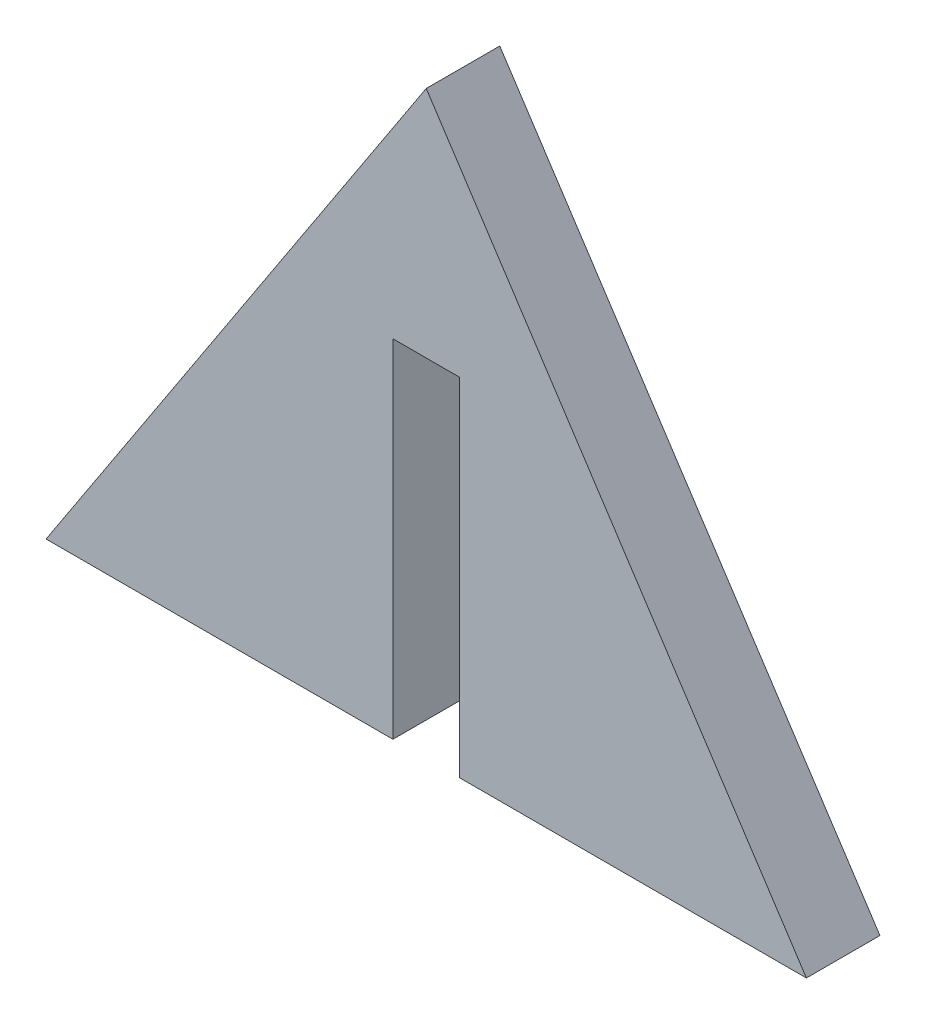
ISO-10303-21;
HEADER;
FILE_DESCRIPTION(('STEP AP214'),'2;1');
FILE_NAME('part.step','',(''),(''),'','','');
FILE_SCHEMA(('AUTOMOTIVE_DESIGN { 1 0 10303 214 1 1 1 1 }'));
ENDSEC;
DATA;
#1=APPLICATION_CONTEXT('core data for automotive mechanical design processes');
#2=APPLICATION_PROTOCOL_DEFINITION('international standard','automotive_design',2000,#1);
#3=PRODUCT_CONTEXT('',#1,'mechanical');
#4=PRODUCT('Part','Part','',(#3));
#5=PRODUCT_RELATED_PRODUCT_CATEGORY('part','',(#4));
#6=PRODUCT_DEFINITION_FORMATION('','',#4);
#7=PRODUCT_DEFINITION_CONTEXT('part definition',#1,'design');
#8=PRODUCT_DEFINITION('design','',#6,#7);
#9=PRODUCT_DEFINITION_SHAPE('','',#8);
#10=(LENGTH_UNIT() NAMED_UNIT(*) SI_UNIT(.MILLI.,.METRE.));
#11=(NAMED_UNIT(*) PLANE_ANGLE_UNIT() SI_UNIT($,.RADIAN.));
#12=(NAMED_UNIT(*) SI_UNIT($,.STERADIAN.) SOLID_ANGLE_UNIT());
#13=UNCERTAINTY_MEASURE_WITH_UNIT(LENGTH_MEASURE(1.E-05),#10,'distance_accuracy_value','');
#14=(GEOMETRIC_REPRESENTATION_CONTEXT(3) GLOBAL_UNCERTAINTY_ASSIGNED_CONTEXT((#13)) GLOBAL_UNIT_ASSIGNED_CONTEXT((#10,
#11,#12)) REPRESENTATION_CONTEXT('',''));
#15=CARTESIAN_POINT('',(0.,0.,0.));
#16=DIRECTION('',(0.,0.,1.));
#17=DIRECTION('',(1.,0.,0.));
#18=AXIS2_PLACEMENT_3D('',#15,#16,#17);
#19=CARTESIAN_POINT('',(-1.2192,6.43954556857363,2.6924));
#20=DIRECTION('',(0.,1.,0.));
#21=DIRECTION('',(-1.,0.,0.));
#22=AXIS2_PLACEMENT_3D('',#19,#20,#21);
#23=PLANE('',#22);
#24=DIRECTION('',(1.,0.,0.));
#25=VECTOR('',#24,1.);
#26=CARTESIAN_POINT('',(-1.2192,6.43954556857363,0.));
#27=LINE('',#26,#25);
#28=CARTESIAN_POINT('',(-13.9192,6.43954556857363,0.));
#29=VERTEX_POINT('',#28);
#30=CARTESIAN_POINT('',(-1.2192,6.43954556857363,0.));
#31=VERTEX_POINT('',#30);
#32=EDGE_CURVE('E137',#29,#31,#27,.T.);
#33=ORIENTED_EDGE('',*,*,#32,.T.);
#34=DIRECTION('',(0.,0.,-1.));
#35=VECTOR('',#34,1.);
#36=CARTESIAN_POINT('',(-1.2192,6.43954556857363,2.6924));
#37=LINE('',#36,#35);
#38=CARTESIAN_POINT('',(-1.2192,6.43954556857363,2.6924));
#39=VERTEX_POINT('',#38);
#40=EDGE_CURVE('E11',#39,#31,#37,.T.);
#41=ORIENTED_EDGE('',*,*,#40,.F.);
#42=DIRECTION('',(1.,0.,0.));
#43=VECTOR('',#42,1.);
#44=CARTESIAN_POINT('',(-1.2192,6.43954556857363,2.6924));
#45=LINE('',#44,#43);
#46=CARTESIAN_POINT('',(-13.9192,6.43954556857363,2.6924));
#47=VERTEX_POINT('',#46);
#48=EDGE_CURVE('E156',#47,#39,#45,.T.);
#49=ORIENTED_EDGE('',*,*,#48,.F.);
#50=DIRECTION('',(0.,0.,-1.));
#51=VECTOR('',#50,1.);
#52=CARTESIAN_POINT('',(-13.9192,6.43954556857363,2.6924));
#53=LINE('',#52,#51);
#54=EDGE_CURVE('E134',#47,#29,#53,.T.);
#55=ORIENTED_EDGE('',*,*,#54,.T.);
#56=EDGE_LOOP('',(#33,#41,#49,#55));
#57=FACE_BOUND('',#56,.T.);
#58=ADVANCED_FACE('F41',(#57),#23,.F.);
#59=CARTESIAN_POINT('',(-1.2192,6.43954556857363,2.6924));
#60=DIRECTION('',(-1.,0.,0.));
#61=DIRECTION('',(0.,0.,1.));
#62=AXIS2_PLACEMENT_3D('',#59,#60,#61);
#63=PLANE('',#62);
#64=DIRECTION('',(0.,1.,0.));
#65=VECTOR('',#64,1.);
#66=CARTESIAN_POINT('',(-1.2192,6.43954556857363,0.));
#67=LINE('',#66,#65);
#68=CARTESIAN_POINT('',(-1.2192,19.1395455685736,0.));
#69=VERTEX_POINT('',#68);
#70=EDGE_CURVE('E143',#31,#69,#67,.T.);
#71=ORIENTED_EDGE('',*,*,#70,.T.);
#72=DIRECTION('',(0.,0.,-1.));
#73=VECTOR('',#72,1.);
#74=CARTESIAN_POINT('',(-1.2192,19.1395455685736,2.6924));
#75=LINE('',#74,#73);
#76=CARTESIAN_POINT('',(-1.2192,19.1395455685736,2.6924));
#77=VERTEX_POINT('',#76);
#78=EDGE_CURVE('E49',#77,#69,#75,.T.);
#79=ORIENTED_EDGE('',*,*,#78,.F.);
#80=DIRECTION('',(0.,1.,0.));
#81=VECTOR('',#80,1.);
#82=CARTESIAN_POINT('',(-1.2192,6.43954556857363,2.6924));
#83=LINE('',#82,#81);
#84=EDGE_CURVE('E98',#39,#77,#83,.T.);
#85=ORIENTED_EDGE('',*,*,#84,.F.);
#86=ORIENTED_EDGE('',*,*,#40,.T.);
#87=EDGE_LOOP('',(#71,#79,#85,#86));
#88=FACE_BOUND('',#87,.T.);
#89=ADVANCED_FACE('F194',(#88),#63,.F.);
#90=CARTESIAN_POINT('',(-1.2192,19.1395455685736,2.6924));
#91=DIRECTION('',(0.,1.,0.));
#92=DIRECTION('',(0.,0.,1.));
#93=AXIS2_PLACEMENT_3D('',#90,#91,#92);
#94=PLANE('',#93);
#95=DIRECTION('',(1.,0.,0.));
#96=VECTOR('',#95,1.);
#97=CARTESIAN_POINT('',(-1.2192,19.1395455685736,0.));
#98=LINE('',#97,#96);
#99=CARTESIAN_POINT('',(1.2192,19.1395455685736,0.));
#100=VERTEX_POINT('',#99);
#101=EDGE_CURVE('E145',#69,#100,#98,.T.);
#102=ORIENTED_EDGE('',*,*,#101,.T.);
#103=DIRECTION('',(0.,0.,-1.));
#104=VECTOR('',#103,1.);
#105=CARTESIAN_POINT('',(1.2192,19.1395455685736,2.6924));
#106=LINE('',#105,#104);
#107=CARTESIAN_POINT('',(1.2192,19.1395455685736,2.6924));
#108=VERTEX_POINT('',#107);
#109=EDGE_CURVE('E162',#108,#100,#106,.T.);
#110=ORIENTED_EDGE('',*,*,#109,.F.);
#111=DIRECTION('',(1.,0.,0.));
#112=VECTOR('',#111,1.);
#113=CARTESIAN_POINT('',(-1.2192,19.1395455685736,2.6924));
#114=LINE('',#113,#112);
#115=EDGE_CURVE('E171',#77,#108,#114,.T.);
#116=ORIENTED_EDGE('',*,*,#115,.F.);
#117=ORIENTED_EDGE('',*,*,#78,.T.);
#118=EDGE_LOOP('',(#102,#110,#116,#117));
#119=FACE_BOUND('',#118,.T.);
#120=ADVANCED_FACE('F175',(#119),#94,.F.);
#121=CARTESIAN_POINT('',(1.2192,19.1395455685736,2.6924));
#122=DIRECTION('',(1.,0.,0.));
#123=DIRECTION('',(0.,0.,-1.));
#124=AXIS2_PLACEMENT_3D('',#121,#122,#123);
#125=PLANE('',#124);
#126=DIRECTION('',(0.,-1.,0.));
#127=VECTOR('',#126,1.);
#128=CARTESIAN_POINT('',(1.2192,19.1395455685736,0.));
#129=LINE('',#128,#127);
#130=CARTESIAN_POINT('',(1.2192,6.43954556857363,0.));
#131=VERTEX_POINT('',#130);
#132=EDGE_CURVE('E150',#100,#131,#129,.T.);
#133=ORIENTED_EDGE('',*,*,#132,.T.);
#134=DIRECTION('',(0.,0.,-1.));
#135=VECTOR('',#134,1.);
#136=CARTESIAN_POINT('',(1.2192,6.43954556857363,2.6924));
#137=LINE('',#136,#135);
#138=CARTESIAN_POINT('',(1.2192,6.43954556857363,2.6924));
#139=VERTEX_POINT('',#138);
#140=EDGE_CURVE('E125',#139,#131,#137,.T.);
#141=ORIENTED_EDGE('',*,*,#140,.F.);
#142=DIRECTION('',(0.,-1.,0.));
#143=VECTOR('',#142,1.);
#144=CARTESIAN_POINT('',(1.2192,19.1395455685736,2.6924));
#145=LINE('',#144,#143);
#146=EDGE_CURVE('E111',#108,#139,#145,.T.);
#147=ORIENTED_EDGE('',*,*,#146,.F.);
#148=ORIENTED_EDGE('',*,*,#109,.T.);
#149=EDGE_LOOP('',(#133,#141,#147,#148));
#150=FACE_BOUND('',#149,.T.);
#151=ADVANCED_FACE('F180',(#150),#125,.F.);
#152=CARTESIAN_POINT('',(13.9192,6.43954556857363,2.6924));
#153=DIRECTION('',(0.,1.,0.));
#154=DIRECTION('',(-1.,0.,0.));
#155=AXIS2_PLACEMENT_3D('',#152,#153,#154);
#156=PLANE('',#155);
#157=DIRECTION('',(1.,0.,0.));
#158=VECTOR('',#157,1.);
#159=CARTESIAN_POINT('',(13.9192,6.43954556857363,0.));
#160=LINE('',#159,#158);
#161=CARTESIAN_POINT('',(13.9192,6.43954556857363,0.));
#162=VERTEX_POINT('',#161);
#163=EDGE_CURVE('E124',#131,#162,#160,.T.);
#164=ORIENTED_EDGE('',*,*,#163,.T.);
#165=DIRECTION('',(0.,0.,-1.));
#166=VECTOR('',#165,1.);
#167=CARTESIAN_POINT('',(13.9192,6.43954556857363,2.6924));
#168=LINE('',#167,#166);
#169=CARTESIAN_POINT('',(13.9192,6.43954556857363,2.6924));
#170=VERTEX_POINT('',#169);
#171=EDGE_CURVE('E118',#170,#162,#168,.T.);
#172=ORIENTED_EDGE('',*,*,#171,.F.);
#173=DIRECTION('',(1.,0.,0.));
#174=VECTOR('',#173,1.);
#175=CARTESIAN_POINT('',(13.9192,6.43954556857363,2.6924));
#176=LINE('',#175,#174);
#177=EDGE_CURVE('E107',#139,#170,#176,.T.);
#178=ORIENTED_EDGE('',*,*,#177,.F.);
#179=ORIENTED_EDGE('',*,*,#140,.T.);
#180=EDGE_LOOP('',(#164,#172,#178,#179));
#181=FACE_BOUND('',#180,.T.);
#182=ADVANCED_FACE('F121',(#181),#156,.F.);
#183=CARTESIAN_POINT('',(0.,27.6860952028084,2.6924));
#184=DIRECTION('',(-0.836478332056485,-0.548,0.));
#185=DIRECTION('',(0.548,-0.836478332056485,0.));
#186=AXIS2_PLACEMENT_3D('',#183,#184,#185);
#187=PLANE('',#186);
#188=DIRECTION('',(-0.548,0.836478332056485,0.));
#189=VECTOR('',#188,1.);
#190=CARTESIAN_POINT('',(0.,27.6860952028084,0.));
#191=LINE('',#190,#189);
#192=CARTESIAN_POINT('',(0.,27.6860952028084,0.));
#193=VERTEX_POINT('',#192);
#194=EDGE_CURVE('E83',#162,#193,#191,.T.);
#195=ORIENTED_EDGE('',*,*,#194,.T.);
#196=DIRECTION('',(0.,0.,-1.));
#197=VECTOR('',#196,1.);
#198=CARTESIAN_POINT('',(0.,27.6860952028084,2.6924));
#199=LINE('',#198,#197);
#200=CARTESIAN_POINT('',(0.,27.6860952028084,2.6924));
#201=VERTEX_POINT('',#200);
#202=EDGE_CURVE('E127',#201,#193,#199,.T.);
#203=ORIENTED_EDGE('',*,*,#202,.F.);
#204=DIRECTION('',(-0.548,0.836478332056485,0.));
#205=VECTOR('',#204,1.);
#206=CARTESIAN_POINT('',(0.,27.6860952028084,2.6924));
#207=LINE('',#206,#205);
#208=EDGE_CURVE('E115',#170,#201,#207,.T.);
#209=ORIENTED_EDGE('',*,*,#208,.F.);
#210=ORIENTED_EDGE('',*,*,#171,.T.);
#211=EDGE_LOOP('',(#195,#203,#209,#210));
#212=FACE_BOUND('',#211,.T.);
#213=ADVANCED_FACE('F126',(#212),#187,.F.);
#214=CARTESIAN_POINT('',(-13.9192,6.43954556857363,2.6924));
#215=DIRECTION('',(0.836478332056485,-0.548,0.));
#216=DIRECTION('',(0.548,0.836478332056485,0.));
#217=AXIS2_PLACEMENT_3D('',#214,#215,#216);
#218=PLANE('',#217);
#219=DIRECTION('',(-0.548,-0.836478332056485,0.));
#220=VECTOR('',#219,1.);
#221=CARTESIAN_POINT('',(-13.9192,6.43954556857363,0.));
#222=LINE('',#221,#220);
#223=EDGE_CURVE('E89',#193,#29,#222,.T.);
#224=ORIENTED_EDGE('',*,*,#223,.T.);
#225=ORIENTED_EDGE('',*,*,#54,.F.);
#226=DIRECTION('',(-0.548,-0.836478332056485,0.));
#227=VECTOR('',#226,1.);
#228=CARTESIAN_POINT('',(-13.9192,6.43954556857363,2.6924));
#229=LINE('',#228,#227);
#230=EDGE_CURVE('E59',#201,#47,#229,.T.);
#231=ORIENTED_EDGE('',*,*,#230,.F.);
#232=ORIENTED_EDGE('',*,*,#202,.T.);
#233=EDGE_LOOP('',(#224,#225,#231,#232));
#234=FACE_BOUND('',#233,.T.);
#235=ADVANCED_FACE('F210',(#234),#218,.F.);
#236=CARTESIAN_POINT('',(0.,0.,2.6924));
#237=DIRECTION('',(0.,0.,1.));
#238=DIRECTION('',(1.,0.,0.));
#239=AXIS2_PLACEMENT_3D('',#236,#237,#238);
#240=PLANE('',#239);
#241=ORIENTED_EDGE('',*,*,#48,.T.);
#242=ORIENTED_EDGE('',*,*,#84,.T.);
#243=ORIENTED_EDGE('',*,*,#115,.T.);
#244=ORIENTED_EDGE('',*,*,#146,.T.);
#245=ORIENTED_EDGE('',*,*,#177,.T.);
#246=ORIENTED_EDGE('',*,*,#208,.T.);
#247=ORIENTED_EDGE('',*,*,#230,.T.);
#248=EDGE_LOOP('',(#241,#242,#243,#244,#245,#246,#247));
#249=FACE_BOUND('',#248,.T.);
#250=ADVANCED_FACE('F109',(#249),#240,.T.);
#251=CARTESIAN_POINT('',(0.,0.,0.));
#252=DIRECTION('',(0.,0.,1.));
#253=DIRECTION('',(1.,0.,0.));
#254=AXIS2_PLACEMENT_3D('',#251,#252,#253);
#255=PLANE('',#254);
#256=ORIENTED_EDGE('',*,*,#32,.F.);
#257=ORIENTED_EDGE('',*,*,#223,.F.);
#258=ORIENTED_EDGE('',*,*,#194,.F.);
#259=ORIENTED_EDGE('',*,*,#163,.F.);
#260=ORIENTED_EDGE('',*,*,#132,.F.);
#261=ORIENTED_EDGE('',*,*,#101,.F.);
#262=ORIENTED_EDGE('',*,*,#70,.F.);
#263=EDGE_LOOP('',(#256,#257,#258,#259,#260,#261,#262));
#264=FACE_BOUND('',#263,.T.);
#265=ADVANCED_FACE('F179',(#264),#255,.F.);
#266=CLOSED_SHELL('',(#58,#89,#120,#151,#182,#213,#235,#250,#265));
#267=MANIFOLD_SOLID_BREP('B2',#266);
#268=ADVANCED_BREP_SHAPE_REPRESENTATION('',(#18,#267),#14);
#269=SHAPE_DEFINITION_REPRESENTATION(#9,#268);
ENDSEC;
END-ISO-10303-21;
